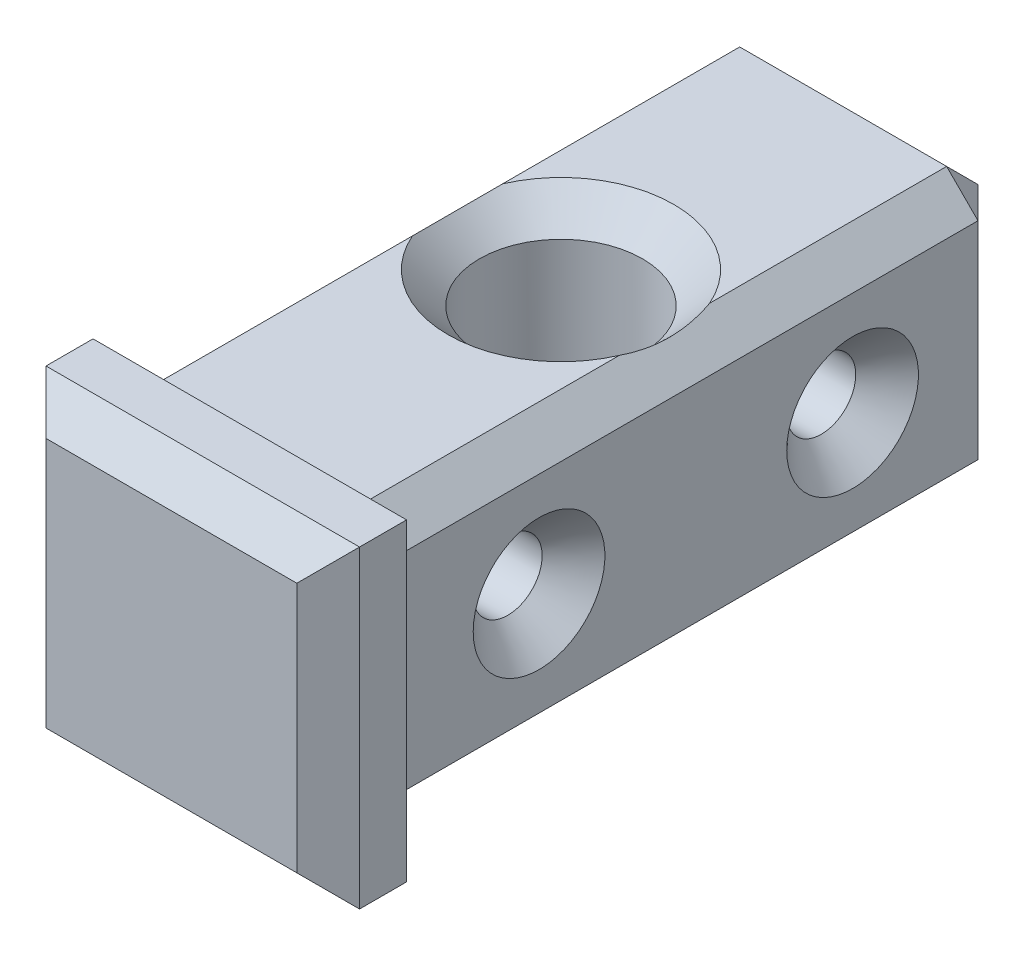
ISO-10303-21;
HEADER;
FILE_DESCRIPTION(('STEP AP214'),'2;1');
FILE_NAME('part.step','',(''),(''),'','','');
FILE_SCHEMA(('AUTOMOTIVE_DESIGN { 1 0 10303 214 1 1 1 1 }'));
ENDSEC;
DATA;
#1=APPLICATION_CONTEXT('core data for automotive mechanical design processes');
#2=APPLICATION_PROTOCOL_DEFINITION('international standard','automotive_design',2000,#1);
#3=PRODUCT_CONTEXT('',#1,'mechanical');
#4=PRODUCT('Part','Part','',(#3));
#5=PRODUCT_RELATED_PRODUCT_CATEGORY('part','',(#4));
#6=PRODUCT_DEFINITION_FORMATION('','',#4);
#7=PRODUCT_DEFINITION_CONTEXT('part definition',#1,'design');
#8=PRODUCT_DEFINITION('design','',#6,#7);
#9=PRODUCT_DEFINITION_SHAPE('','',#8);
#10=(LENGTH_UNIT() NAMED_UNIT(*) SI_UNIT(.MILLI.,.METRE.));
#11=(NAMED_UNIT(*) PLANE_ANGLE_UNIT() SI_UNIT($,.RADIAN.));
#12=(NAMED_UNIT(*) SI_UNIT($,.STERADIAN.) SOLID_ANGLE_UNIT());
#13=UNCERTAINTY_MEASURE_WITH_UNIT(LENGTH_MEASURE(1.E-05),#10,'distance_accuracy_value','');
#14=(GEOMETRIC_REPRESENTATION_CONTEXT(3) GLOBAL_UNCERTAINTY_ASSIGNED_CONTEXT((#13)) GLOBAL_UNIT_ASSIGNED_CONTEXT((#10,
#11,#12)) REPRESENTATION_CONTEXT('',''));
#15=CARTESIAN_POINT('',(0.,0.,0.));
#16=DIRECTION('',(0.,0.,1.));
#17=DIRECTION('',(1.,0.,0.));
#18=AXIS2_PLACEMENT_3D('',#15,#16,#17);
#19=CARTESIAN_POINT('',(0.,21.844,50.8));
#20=DIRECTION('',(0.,-1.,0.));
#21=DIRECTION('',(0.,0.,-1.));
#22=AXIS2_PLACEMENT_3D('',#19,#20,#21);
#23=PLANE('',#22);
#24=CARTESIAN_POINT('',(10.922,21.844,25.4));
#25=DIRECTION('',(0.,-1.,0.));
#26=DIRECTION('',(0.,0.,-1.));
#27=AXIS2_PLACEMENT_3D('',#24,#25,#26);
#28=CIRCLE('',#27,9.14400000000004);
#29=CARTESIAN_POINT('',(2.54000000000003,21.844,21.7455763792356));
#30=VERTEX_POINT('',#29);
#31=CARTESIAN_POINT('',(19.304,21.844,21.7455763792355));
#32=VERTEX_POINT('',#31);
#33=EDGE_CURVE('E373',#30,#32,#28,.T.);
#34=ORIENTED_EDGE('',*,*,#33,.T.);
#35=DIRECTION('',(0.,0.,-1.));
#36=VECTOR('',#35,1.);
#37=CARTESIAN_POINT('',(19.304,21.844,50.8));
#38=LINE('',#37,#36);
#39=CARTESIAN_POINT('',(19.304,21.844,2.54000000000003));
#40=VERTEX_POINT('',#39);
#41=EDGE_CURVE('E382',#32,#40,#38,.T.);
#42=ORIENTED_EDGE('',*,*,#41,.T.);
#43=DIRECTION('',(-1.,0.,0.));
#44=VECTOR('',#43,1.);
#45=CARTESIAN_POINT('',(0.,21.844,2.54000000000003));
#46=LINE('',#45,#44);
#47=CARTESIAN_POINT('',(2.54000000000003,21.844,2.54000000000003));
#48=VERTEX_POINT('',#47);
#49=EDGE_CURVE('E379',#40,#48,#46,.T.);
#50=ORIENTED_EDGE('',*,*,#49,.T.);
#51=DIRECTION('',(0.,0.,1.));
#52=VECTOR('',#51,1.);
#53=CARTESIAN_POINT('',(2.54000000000003,21.844,50.8));
#54=LINE('',#53,#52);
#55=EDGE_CURVE('E376',#48,#30,#54,.T.);
#56=ORIENTED_EDGE('',*,*,#55,.T.);
#57=EDGE_LOOP('',(#34,#42,#50,#56));
#58=FACE_BOUND('',#57,.T.);
#59=ADVANCED_FACE('F41',(#58),#23,.F.);
#60=CARTESIAN_POINT('',(0.,0.,50.8));
#61=DIRECTION('',(0.,1.,0.));
#62=DIRECTION('',(0.,0.,1.));
#63=AXIS2_PLACEMENT_3D('',#60,#61,#62);
#64=PLANE('',#63);
#65=DIRECTION('',(1.,0.,0.));
#66=VECTOR('',#65,1.);
#67=CARTESIAN_POINT('',(0.,0.,50.8));
#68=LINE('',#67,#66);
#69=CARTESIAN_POINT('',(2.54000000000003,0.,50.8));
#70=VERTEX_POINT('',#69);
#71=CARTESIAN_POINT('',(19.304,0.,50.8));
#72=VERTEX_POINT('',#71);
#73=EDGE_CURVE('E241',#70,#72,#68,.T.);
#74=ORIENTED_EDGE('',*,*,#73,.F.);
#75=DIRECTION('',(0.,0.,-1.));
#76=VECTOR('',#75,1.);
#77=CARTESIAN_POINT('',(2.54000000000003,0.,50.8));
#78=LINE('',#77,#76);
#79=CARTESIAN_POINT('',(2.54000000000003,0.,29.0544236207643));
#80=VERTEX_POINT('',#79);
#81=EDGE_CURVE('E276',#70,#80,#78,.T.);
#82=ORIENTED_EDGE('',*,*,#81,.T.);
#83=CARTESIAN_POINT('',(10.922,0.,25.4));
#84=DIRECTION('',(0.,1.,0.));
#85=DIRECTION('',(0.,0.,1.));
#86=AXIS2_PLACEMENT_3D('',#83,#84,#85);
#87=CIRCLE('',#86,9.144);
#88=CARTESIAN_POINT('',(10.922,0.,34.544));
#89=VERTEX_POINT('',#88);
#90=EDGE_CURVE('E272',#80,#89,#87,.T.);
#91=ORIENTED_EDGE('',*,*,#90,.T.);
#92=CARTESIAN_POINT('',(10.922,0.,25.4));
#93=DIRECTION('',(0.,1.,0.));
#94=DIRECTION('',(0.,0.,1.));
#95=AXIS2_PLACEMENT_3D('',#92,#93,#94);
#96=CIRCLE('',#95,9.144);
#97=CARTESIAN_POINT('',(19.304,0.,29.0544236207644));
#98=VERTEX_POINT('',#97);
#99=EDGE_CURVE('E269',#89,#98,#96,.T.);
#100=ORIENTED_EDGE('',*,*,#99,.T.);
#101=DIRECTION('',(0.,0.,1.));
#102=VECTOR('',#101,1.);
#103=CARTESIAN_POINT('',(19.304,0.,50.8));
#104=LINE('',#103,#102);
#105=EDGE_CURVE('E266',#98,#72,#104,.T.);
#106=ORIENTED_EDGE('',*,*,#105,.T.);
#107=EDGE_LOOP('',(#74,#82,#91,#100,#106));
#108=FACE_BOUND('',#107,.T.);
#109=ADVANCED_FACE('F596',(#108),#64,.F.);
#110=CARTESIAN_POINT('',(0.,0.,50.8));
#111=DIRECTION('',(1.,0.,0.));
#112=DIRECTION('',(0.,0.,-1.));
#113=AXIS2_PLACEMENT_3D('',#110,#111,#112);
#114=PLANE('',#113);
#115=CARTESIAN_POINT('',(0.,10.922,38.1));
#116=DIRECTION('',(1.,0.,0.));
#117=DIRECTION('',(0.,0.,-1.));
#118=AXIS2_PLACEMENT_3D('',#115,#116,#117);
#119=CIRCLE('',#118,5.33400000000002);
#120=CARTESIAN_POINT('',(0.,10.922,32.766));
#121=VERTEX_POINT('',#120);
#122=EDGE_CURVE('E348',#121,#121,#119,.T.);
#123=ORIENTED_EDGE('',*,*,#122,.T.);
#124=EDGE_LOOP('',(#123));
#125=FACE_BOUND('',#124,.T.);
#126=CARTESIAN_POINT('',(0.,10.922,12.7));
#127=DIRECTION('',(1.,0.,0.));
#128=DIRECTION('',(0.,0.,-1.));
#129=AXIS2_PLACEMENT_3D('',#126,#127,#128);
#130=CIRCLE('',#129,5.33400000000001);
#131=CARTESIAN_POINT('',(0.,10.922,7.36599999999998));
#132=VERTEX_POINT('',#131);
#133=EDGE_CURVE('E344',#132,#132,#130,.T.);
#134=ORIENTED_EDGE('',*,*,#133,.T.);
#135=EDGE_LOOP('',(#134));
#136=FACE_BOUND('',#135,.T.);
#137=DIRECTION('',(0.,-1.,0.));
#138=VECTOR('',#137,1.);
#139=CARTESIAN_POINT('',(0.,0.,2.54000000000001));
#140=LINE('',#139,#138);
#141=CARTESIAN_POINT('',(0.,19.304,2.54000000000001));
#142=VERTEX_POINT('',#141);
#143=CARTESIAN_POINT('',(0.,2.54000000000001,2.54000000000001));
#144=VERTEX_POINT('',#143);
#145=EDGE_CURVE('E355',#142,#144,#140,.T.);
#146=ORIENTED_EDGE('',*,*,#145,.T.);
#147=DIRECTION('',(0.,0.,1.));
#148=VECTOR('',#147,1.);
#149=CARTESIAN_POINT('',(0.,2.54000000000001,50.8));
#150=LINE('',#149,#148);
#151=CARTESIAN_POINT('',(0.,2.54000000000001,50.8));
#152=VERTEX_POINT('',#151);
#153=EDGE_CURVE('E358',#144,#152,#150,.T.);
#154=ORIENTED_EDGE('',*,*,#153,.T.);
#155=DIRECTION('',(0.,-1.,0.));
#156=VECTOR('',#155,1.);
#157=CARTESIAN_POINT('',(0.,0.,50.8));
#158=LINE('',#157,#156);
#159=CARTESIAN_POINT('',(0.,19.304,50.8));
#160=VERTEX_POINT('',#159);
#161=EDGE_CURVE('E202',#160,#152,#158,.T.);
#162=ORIENTED_EDGE('',*,*,#161,.F.);
#163=DIRECTION('',(0.,0.,-1.));
#164=VECTOR('',#163,1.);
#165=CARTESIAN_POINT('',(0.,19.304,50.8));
#166=LINE('',#165,#164);
#167=EDGE_CURVE('E352',#160,#142,#166,.T.);
#168=ORIENTED_EDGE('',*,*,#167,.T.);
#169=EDGE_LOOP('',(#146,#154,#162,#168));
#170=FACE_BOUND('',#169,.T.);
#171=ADVANCED_FACE('F603',(#125,#136,#170),#114,.F.);
#172=DIRECTION('',(0.,0.,1.));
#173=VECTOR('',#172,1.);
#174=CARTESIAN_POINT('',(19.304,0.,50.8));
#175=LINE('',#174,#173);
#176=CARTESIAN_POINT('',(19.304,0.,2.54000000000001));
#177=VERTEX_POINT('',#176);
#178=CARTESIAN_POINT('',(19.304,0.,21.7455763792356));
#179=VERTEX_POINT('',#178);
#180=EDGE_CURVE('E256',#177,#179,#175,.T.);
#181=ORIENTED_EDGE('',*,*,#180,.T.);
#182=CARTESIAN_POINT('',(10.922,0.,25.4));
#183=DIRECTION('',(0.,1.,0.));
#184=DIRECTION('',(0.,0.,1.));
#185=AXIS2_PLACEMENT_3D('',#182,#183,#184);
#186=CIRCLE('',#185,9.144);
#187=CARTESIAN_POINT('',(2.54000000000003,0.,21.7455763792357));
#188=VERTEX_POINT('',#187);
#189=EDGE_CURVE('E262',#179,#188,#186,.T.);
#190=ORIENTED_EDGE('',*,*,#189,.T.);
#191=DIRECTION('',(0.,0.,-1.));
#192=VECTOR('',#191,1.);
#193=CARTESIAN_POINT('',(2.54000000000003,0.,50.8));
#194=LINE('',#193,#192);
#195=CARTESIAN_POINT('',(2.54000000000003,0.,2.54000000000001));
#196=VERTEX_POINT('',#195);
#197=EDGE_CURVE('E259',#188,#196,#194,.T.);
#198=ORIENTED_EDGE('',*,*,#197,.T.);
#199=DIRECTION('',(1.,0.,0.));
#200=VECTOR('',#199,1.);
#201=CARTESIAN_POINT('',(21.844,0.,2.54000000000001));
#202=LINE('',#201,#200);
#203=EDGE_CURVE('E253',#196,#177,#202,.T.);
#204=ORIENTED_EDGE('',*,*,#203,.T.);
#205=EDGE_LOOP('',(#181,#190,#198,#204));
#206=FACE_BOUND('',#205,.T.);
#207=ADVANCED_FACE('F606',(#206),#64,.F.);
#208=CARTESIAN_POINT('',(21.844,0.,50.8));
#209=DIRECTION('',(-1.,0.,0.));
#210=DIRECTION('',(0.,0.,1.));
#211=AXIS2_PLACEMENT_3D('',#208,#209,#210);
#212=PLANE('',#211);
#213=CARTESIAN_POINT('',(21.844,10.922,12.7));
#214=DIRECTION('',(-1.,0.,0.));
#215=DIRECTION('',(0.,0.,1.));
#216=AXIS2_PLACEMENT_3D('',#213,#214,#215);
#217=CIRCLE('',#216,5.334);
#218=CARTESIAN_POINT('',(21.844,10.922,18.034));
#219=VERTEX_POINT('',#218);
#220=EDGE_CURVE('E300',#219,#219,#217,.T.);
#221=ORIENTED_EDGE('',*,*,#220,.T.);
#222=EDGE_LOOP('',(#221));
#223=FACE_BOUND('',#222,.T.);
#224=CARTESIAN_POINT('',(21.844,10.922,38.1));
#225=DIRECTION('',(-1.,0.,0.));
#226=DIRECTION('',(0.,0.,1.));
#227=AXIS2_PLACEMENT_3D('',#224,#225,#226);
#228=CIRCLE('',#227,5.33399999999999);
#229=CARTESIAN_POINT('',(21.844,10.922,43.434));
#230=VERTEX_POINT('',#229);
#231=EDGE_CURVE('E296',#230,#230,#228,.T.);
#232=ORIENTED_EDGE('',*,*,#231,.T.);
#233=EDGE_LOOP('',(#232));
#234=FACE_BOUND('',#233,.T.);
#235=DIRECTION('',(0.,1.,0.));
#236=VECTOR('',#235,1.);
#237=CARTESIAN_POINT('',(21.844,0.,50.8));
#238=LINE('',#237,#236);
#239=CARTESIAN_POINT('',(21.844,2.54000000000001,50.8));
#240=VERTEX_POINT('',#239);
#241=CARTESIAN_POINT('',(21.844,19.304,50.8));
#242=VERTEX_POINT('',#241);
#243=EDGE_CURVE('E245',#240,#242,#238,.T.);
#244=ORIENTED_EDGE('',*,*,#243,.F.);
#245=DIRECTION('',(0.,0.,-1.));
#246=VECTOR('',#245,1.);
#247=CARTESIAN_POINT('',(21.844,2.54000000000001,50.8));
#248=LINE('',#247,#246);
#249=CARTESIAN_POINT('',(21.844,2.54000000000001,2.54000000000001));
#250=VERTEX_POINT('',#249);
#251=EDGE_CURVE('E293',#240,#250,#248,.T.);
#252=ORIENTED_EDGE('',*,*,#251,.T.);
#253=DIRECTION('',(0.,1.,0.));
#254=VECTOR('',#253,1.);
#255=CARTESIAN_POINT('',(21.844,21.844,2.54000000000001));
#256=LINE('',#255,#254);
#257=CARTESIAN_POINT('',(21.844,19.304,2.54000000000001));
#258=VERTEX_POINT('',#257);
#259=EDGE_CURVE('E287',#250,#258,#256,.T.);
#260=ORIENTED_EDGE('',*,*,#259,.T.);
#261=DIRECTION('',(0.,0.,1.));
#262=VECTOR('',#261,1.);
#263=CARTESIAN_POINT('',(21.844,19.304,50.8));
#264=LINE('',#263,#262);
#265=EDGE_CURVE('E290',#258,#242,#264,.T.);
#266=ORIENTED_EDGE('',*,*,#265,.T.);
#267=EDGE_LOOP('',(#244,#252,#260,#266));
#268=FACE_BOUND('',#267,.T.);
#269=ADVANCED_FACE('F611',(#223,#234,#268),#212,.F.);
#270=DIRECTION('',(-1.,0.,0.));
#271=VECTOR('',#270,1.);
#272=CARTESIAN_POINT('',(0.,21.844,50.8));
#273=LINE('',#272,#271);
#274=CARTESIAN_POINT('',(19.304,21.844,50.8));
#275=VERTEX_POINT('',#274);
#276=CARTESIAN_POINT('',(2.54000000000003,21.844,50.8));
#277=VERTEX_POINT('',#276);
#278=EDGE_CURVE('E249',#275,#277,#273,.T.);
#279=ORIENTED_EDGE('',*,*,#278,.F.);
#280=DIRECTION('',(0.,0.,-1.));
#281=VECTOR('',#280,1.);
#282=CARTESIAN_POINT('',(19.304,21.844,50.8));
#283=LINE('',#282,#281);
#284=CARTESIAN_POINT('',(19.304,21.844,29.0544236207645));
#285=VERTEX_POINT('',#284);
#286=EDGE_CURVE('E370',#275,#285,#283,.T.);
#287=ORIENTED_EDGE('',*,*,#286,.T.);
#288=CARTESIAN_POINT('',(10.922,21.844,25.4));
#289=DIRECTION('',(0.,-1.,0.));
#290=DIRECTION('',(0.,0.,-1.));
#291=AXIS2_PLACEMENT_3D('',#288,#289,#290);
#292=CIRCLE('',#291,9.14400000000004);
#293=CARTESIAN_POINT('',(10.922,21.844,34.544));
#294=VERTEX_POINT('',#293);
#295=EDGE_CURVE('E364',#285,#294,#292,.T.);
#296=ORIENTED_EDGE('',*,*,#295,.T.);
#297=CARTESIAN_POINT('',(10.922,21.844,25.4));
#298=DIRECTION('',(0.,-1.,0.));
#299=DIRECTION('',(0.,0.,-1.));
#300=AXIS2_PLACEMENT_3D('',#297,#298,#299);
#301=CIRCLE('',#300,9.14400000000004);
#302=CARTESIAN_POINT('',(2.54000000000003,21.844,29.0544236207644));
#303=VERTEX_POINT('',#302);
#304=EDGE_CURVE('E361',#294,#303,#301,.T.);
#305=ORIENTED_EDGE('',*,*,#304,.T.);
#306=DIRECTION('',(0.,0.,1.));
#307=VECTOR('',#306,1.);
#308=CARTESIAN_POINT('',(2.54000000000003,21.844,50.8));
#309=LINE('',#308,#307);
#310=EDGE_CURVE('E367',#303,#277,#309,.T.);
#311=ORIENTED_EDGE('',*,*,#310,.T.);
#312=EDGE_LOOP('',(#279,#287,#296,#305,#311));
#313=FACE_BOUND('',#312,.T.);
#314=ADVANCED_FACE('F599',(#313),#23,.F.);
#315=CARTESIAN_POINT('',(0.,0.,0.));
#316=DIRECTION('',(0.,0.,-1.));
#317=DIRECTION('',(-1.,0.,0.));
#318=AXIS2_PLACEMENT_3D('',#315,#316,#317);
#319=PLANE('',#318);
#320=DIRECTION('',(1.,0.,0.));
#321=VECTOR('',#320,1.);
#322=CARTESIAN_POINT('',(21.844,19.304,0.));
#323=LINE('',#322,#321);
#324=CARTESIAN_POINT('',(2.54000000000003,19.304,0.));
#325=VERTEX_POINT('',#324);
#326=CARTESIAN_POINT('',(19.304,19.304,0.));
#327=VERTEX_POINT('',#326);
#328=EDGE_CURVE('E386',#325,#327,#323,.T.);
#329=ORIENTED_EDGE('',*,*,#328,.T.);
#330=DIRECTION('',(0.,-1.,0.));
#331=VECTOR('',#330,1.);
#332=CARTESIAN_POINT('',(19.304,0.,0.));
#333=LINE('',#332,#331);
#334=CARTESIAN_POINT('',(19.304,2.54000000000003,0.));
#335=VERTEX_POINT('',#334);
#336=EDGE_CURVE('E394',#327,#335,#333,.T.);
#337=ORIENTED_EDGE('',*,*,#336,.T.);
#338=DIRECTION('',(-1.,0.,0.));
#339=VECTOR('',#338,1.);
#340=CARTESIAN_POINT('',(0.,2.54000000000003,0.));
#341=LINE('',#340,#339);
#342=CARTESIAN_POINT('',(2.54000000000003,2.54000000000003,0.));
#343=VERTEX_POINT('',#342);
#344=EDGE_CURVE('E68',#335,#343,#341,.T.);
#345=ORIENTED_EDGE('',*,*,#344,.T.);
#346=DIRECTION('',(0.,1.,0.));
#347=VECTOR('',#346,1.);
#348=CARTESIAN_POINT('',(2.54000000000003,21.844,0.));
#349=LINE('',#348,#347);
#350=EDGE_CURVE('E389',#343,#325,#349,.T.);
#351=ORIENTED_EDGE('',*,*,#350,.T.);
#352=EDGE_LOOP('',(#329,#337,#345,#351));
#353=FACE_BOUND('',#352,.T.);
#354=ADVANCED_FACE('F610',(#353),#319,.T.);
#355=CARTESIAN_POINT('',(-1.5875,-1.9685,57.15));
#356=DIRECTION('',(1.,0.,0.));
#357=DIRECTION('',(0.,0.,-1.));
#358=AXIS2_PLACEMENT_3D('',#355,#356,#357);
#359=PLANE('',#358);
#360=DIRECTION('',(0.,0.,-1.));
#361=VECTOR('',#360,1.);
#362=CARTESIAN_POINT('',(-1.5875,-1.9685,57.15));
#363=LINE('',#362,#361);
#364=CARTESIAN_POINT('',(-1.5875,-1.9685,54.61));
#365=VERTEX_POINT('',#364);
#366=CARTESIAN_POINT('',(-1.5875,-1.9685,50.8));
#367=VERTEX_POINT('',#366);
#368=EDGE_CURVE('E191',#365,#367,#363,.T.);
#369=ORIENTED_EDGE('',*,*,#368,.F.);
#370=DIRECTION('',(0.,1.,0.));
#371=VECTOR('',#370,1.);
#372=CARTESIAN_POINT('',(-1.5875,-1.9685,54.61));
#373=LINE('',#372,#371);
#374=CARTESIAN_POINT('',(-1.5875,23.4315,54.61));
#375=VERTEX_POINT('',#374);
#376=EDGE_CURVE('E338',#365,#375,#373,.T.);
#377=ORIENTED_EDGE('',*,*,#376,.T.);
#378=DIRECTION('',(0.,0.,-1.));
#379=VECTOR('',#378,1.);
#380=CARTESIAN_POINT('',(-1.5875,23.4315,57.15));
#381=LINE('',#380,#379);
#382=CARTESIAN_POINT('',(-1.5875,23.4315,50.8));
#383=VERTEX_POINT('',#382);
#384=EDGE_CURVE('E216',#375,#383,#381,.T.);
#385=ORIENTED_EDGE('',*,*,#384,.T.);
#386=DIRECTION('',(0.,-1.,0.));
#387=VECTOR('',#386,1.);
#388=CARTESIAN_POINT('',(-1.5875,-1.9685,50.8));
#389=LINE('',#388,#387);
#390=EDGE_CURVE('E209',#383,#367,#389,.T.);
#391=ORIENTED_EDGE('',*,*,#390,.T.);
#392=EDGE_LOOP('',(#369,#377,#385,#391));
#393=FACE_BOUND('',#392,.T.);
#394=ADVANCED_FACE('F214',(#393),#359,.F.);
#395=CARTESIAN_POINT('',(-1.5875,-1.9685,57.15));
#396=DIRECTION('',(0.,1.,0.));
#397=DIRECTION('',(0.,0.,1.));
#398=AXIS2_PLACEMENT_3D('',#395,#396,#397);
#399=PLANE('',#398);
#400=DIRECTION('',(0.,0.,-1.));
#401=VECTOR('',#400,1.);
#402=CARTESIAN_POINT('',(23.8125,-1.9685,57.15));
#403=LINE('',#402,#401);
#404=CARTESIAN_POINT('',(23.8125,-1.9685,54.61));
#405=VERTEX_POINT('',#404);
#406=CARTESIAN_POINT('',(23.8125,-1.9685,50.8));
#407=VERTEX_POINT('',#406);
#408=EDGE_CURVE('E203',#405,#407,#403,.T.);
#409=ORIENTED_EDGE('',*,*,#408,.F.);
#410=DIRECTION('',(-1.,0.,0.));
#411=VECTOR('',#410,1.);
#412=CARTESIAN_POINT('',(-1.5875,-1.9685,54.61));
#413=LINE('',#412,#411);
#414=EDGE_CURVE('E198',#405,#365,#413,.T.);
#415=ORIENTED_EDGE('',*,*,#414,.T.);
#416=ORIENTED_EDGE('',*,*,#368,.T.);
#417=DIRECTION('',(1.,0.,0.));
#418=VECTOR('',#417,1.);
#419=CARTESIAN_POINT('',(-1.5875,-1.9685,50.8));
#420=LINE('',#419,#418);
#421=EDGE_CURVE('E195',#367,#407,#420,.T.);
#422=ORIENTED_EDGE('',*,*,#421,.T.);
#423=EDGE_LOOP('',(#409,#415,#416,#422));
#424=FACE_BOUND('',#423,.T.);
#425=ADVANCED_FACE('F194',(#424),#399,.F.);
#426=CARTESIAN_POINT('',(23.8125,-1.9685,57.15));
#427=DIRECTION('',(-1.,0.,0.));
#428=DIRECTION('',(0.,0.,1.));
#429=AXIS2_PLACEMENT_3D('',#426,#427,#428);
#430=PLANE('',#429);
#431=DIRECTION('',(0.,0.,-1.));
#432=VECTOR('',#431,1.);
#433=CARTESIAN_POINT('',(23.8125,23.4315,57.15));
#434=LINE('',#433,#432);
#435=CARTESIAN_POINT('',(23.8125,23.4315,54.61));
#436=VERTEX_POINT('',#435);
#437=CARTESIAN_POINT('',(23.8125,23.4315,50.8));
#438=VERTEX_POINT('',#437);
#439=EDGE_CURVE('E233',#436,#438,#434,.T.);
#440=ORIENTED_EDGE('',*,*,#439,.F.);
#441=DIRECTION('',(0.,-1.,0.));
#442=VECTOR('',#441,1.);
#443=CARTESIAN_POINT('',(23.8125,-1.9685,54.61));
#444=LINE('',#443,#442);
#445=EDGE_CURVE('E335',#436,#405,#444,.T.);
#446=ORIENTED_EDGE('',*,*,#445,.T.);
#447=ORIENTED_EDGE('',*,*,#408,.T.);
#448=DIRECTION('',(0.,1.,0.));
#449=VECTOR('',#448,1.);
#450=CARTESIAN_POINT('',(23.8125,-1.9685,50.8));
#451=LINE('',#450,#449);
#452=EDGE_CURVE('E211',#407,#438,#451,.T.);
#453=ORIENTED_EDGE('',*,*,#452,.T.);
#454=EDGE_LOOP('',(#440,#446,#447,#453));
#455=FACE_BOUND('',#454,.T.);
#456=ADVANCED_FACE('F746',(#455),#430,.F.);
#457=CARTESIAN_POINT('',(-1.5875,23.4315,57.15));
#458=DIRECTION('',(0.,-1.,0.));
#459=DIRECTION('',(0.,0.,-1.));
#460=AXIS2_PLACEMENT_3D('',#457,#458,#459);
#461=PLANE('',#460);
#462=ORIENTED_EDGE('',*,*,#384,.F.);
#463=DIRECTION('',(1.,0.,0.));
#464=VECTOR('',#463,1.);
#465=CARTESIAN_POINT('',(-1.5875,23.4315,54.61));
#466=LINE('',#465,#464);
#467=EDGE_CURVE('E341',#375,#436,#466,.T.);
#468=ORIENTED_EDGE('',*,*,#467,.T.);
#469=ORIENTED_EDGE('',*,*,#439,.T.);
#470=DIRECTION('',(-1.,0.,0.));
#471=VECTOR('',#470,1.);
#472=CARTESIAN_POINT('',(-1.5875,23.4315,50.8));
#473=LINE('',#472,#471);
#474=EDGE_CURVE('E228',#438,#383,#473,.T.);
#475=ORIENTED_EDGE('',*,*,#474,.T.);
#476=EDGE_LOOP('',(#462,#468,#469,#475));
#477=FACE_BOUND('',#476,.T.);
#478=ADVANCED_FACE('F741',(#477),#461,.F.);
#479=CARTESIAN_POINT('',(0.,0.,57.15));
#480=DIRECTION('',(0.,0.,-1.));
#481=DIRECTION('',(-1.,0.,0.));
#482=AXIS2_PLACEMENT_3D('',#479,#480,#481);
#483=PLANE('',#482);
#484=DIRECTION('',(0.,-1.,0.));
#485=VECTOR('',#484,1.);
#486=CARTESIAN_POINT('',(0.952500000000001,0.,57.15));
#487=LINE('',#486,#485);
#488=CARTESIAN_POINT('',(0.952500000000001,20.8915,57.15));
#489=VERTEX_POINT('',#488);
#490=CARTESIAN_POINT('',(0.952500000000001,0.571499999999999,57.15));
#491=VERTEX_POINT('',#490);
#492=EDGE_CURVE('E323',#489,#491,#487,.T.);
#493=ORIENTED_EDGE('',*,*,#492,.T.);
#494=DIRECTION('',(1.,0.,0.));
#495=VECTOR('',#494,1.);
#496=CARTESIAN_POINT('',(0.,0.571499999999999,57.15));
#497=LINE('',#496,#495);
#498=CARTESIAN_POINT('',(21.2725,0.571499999999999,57.15));
#499=VERTEX_POINT('',#498);
#500=EDGE_CURVE('E329',#491,#499,#497,.T.);
#501=ORIENTED_EDGE('',*,*,#500,.T.);
#502=DIRECTION('',(0.,1.,0.));
#503=VECTOR('',#502,1.);
#504=CARTESIAN_POINT('',(21.2725,0.,57.15));
#505=LINE('',#504,#503);
#506=CARTESIAN_POINT('',(21.2725,20.8915,57.15));
#507=VERTEX_POINT('',#506);
#508=EDGE_CURVE('E326',#499,#507,#505,.T.);
#509=ORIENTED_EDGE('',*,*,#508,.T.);
#510=DIRECTION('',(-1.,0.,0.));
#511=VECTOR('',#510,1.);
#512=CARTESIAN_POINT('',(0.,20.8915,57.15));
#513=LINE('',#512,#511);
#514=EDGE_CURVE('E320',#507,#489,#513,.T.);
#515=ORIENTED_EDGE('',*,*,#514,.T.);
#516=EDGE_LOOP('',(#493,#501,#509,#515));
#517=FACE_BOUND('',#516,.T.);
#518=ADVANCED_FACE('F736',(#517),#483,.F.);
#519=CARTESIAN_POINT('',(0.,0.,50.8));
#520=DIRECTION('',(0.,0.,-1.));
#521=DIRECTION('',(-1.,0.,0.));
#522=AXIS2_PLACEMENT_3D('',#519,#520,#521);
#523=PLANE('',#522);
#524=ORIENTED_EDGE('',*,*,#243,.T.);
#525=DIRECTION('',(0.70710678118655,-0.707106781186545,0.));
#526=VECTOR('',#525,1.);
#527=CARTESIAN_POINT('',(19.304,21.844,50.8));
#528=LINE('',#527,#526);
#529=EDGE_CURVE('E52',#242,#275,#528,.F.);
#530=ORIENTED_EDGE('',*,*,#529,.T.);
#531=ORIENTED_EDGE('',*,*,#278,.T.);
#532=DIRECTION('',(0.70710678118655,0.707106781186545,0.));
#533=VECTOR('',#532,1.);
#534=CARTESIAN_POINT('',(0.,19.304,50.8));
#535=LINE('',#534,#533);
#536=EDGE_CURVE('E11',#277,#160,#535,.F.);
#537=ORIENTED_EDGE('',*,*,#536,.T.);
#538=ORIENTED_EDGE('',*,*,#161,.T.);
#539=DIRECTION('',(-0.70710678118655,0.707106781186545,0.));
#540=VECTOR('',#539,1.);
#541=CARTESIAN_POINT('',(2.54000000000003,0.,50.8));
#542=LINE('',#541,#540);
#543=EDGE_CURVE('E397',#152,#70,#542,.F.);
#544=ORIENTED_EDGE('',*,*,#543,.T.);
#545=ORIENTED_EDGE('',*,*,#73,.T.);
#546=DIRECTION('',(-0.70710678118655,-0.707106781186545,0.));
#547=VECTOR('',#546,1.);
#548=CARTESIAN_POINT('',(21.844,2.54000000000001,50.8));
#549=LINE('',#548,#547);
#550=EDGE_CURVE('E400',#72,#240,#549,.F.);
#551=ORIENTED_EDGE('',*,*,#550,.T.);
#552=EDGE_LOOP('',(#524,#530,#531,#537,#538,#544,#545,#551));
#553=FACE_BOUND('',#552,.T.);
#554=ORIENTED_EDGE('',*,*,#390,.F.);
#555=ORIENTED_EDGE('',*,*,#474,.F.);
#556=ORIENTED_EDGE('',*,*,#452,.F.);
#557=ORIENTED_EDGE('',*,*,#421,.F.);
#558=EDGE_LOOP('',(#554,#555,#556,#557));
#559=FACE_BOUND('',#558,.T.);
#560=ADVANCED_FACE('F207',(#553,#559),#523,.T.);
#561=CARTESIAN_POINT('',(23.8125,10.922,12.7));
#562=DIRECTION('',(-1.,0.,0.));
#563=DIRECTION('',(0.,0.,1.));
#564=AXIS2_PLACEMENT_3D('',#561,#562,#563);
#565=CYLINDRICAL_SURFACE('',#564,2.794);
#566=CARTESIAN_POINT('',(19.304,10.922,12.7));
#567=DIRECTION('',(-1.,0.,0.));
#568=DIRECTION('',(0.,0.,1.));
#569=AXIS2_PLACEMENT_3D('',#566,#567,#568);
#570=CIRCLE('',#569,2.794);
#571=CARTESIAN_POINT('',(19.304,10.922,15.494));
#572=VERTEX_POINT('',#571);
#573=EDGE_CURVE('E308',#572,#572,#570,.F.);
#574=ORIENTED_EDGE('',*,*,#573,.T.);
#575=EDGE_LOOP('',(#574));
#576=FACE_BOUND('',#575,.T.);
#577=CARTESIAN_POINT('',(2.54,10.922,12.7));
#578=DIRECTION('',(1.,0.,0.));
#579=DIRECTION('',(0.,0.,-1.));
#580=AXIS2_PLACEMENT_3D('',#577,#578,#579);
#581=CIRCLE('',#580,2.794);
#582=CARTESIAN_POINT('',(2.54,10.922,9.906));
#583=VERTEX_POINT('',#582);
#584=EDGE_CURVE('E304',#583,#583,#581,.F.);
#585=ORIENTED_EDGE('',*,*,#584,.T.);
#586=EDGE_LOOP('',(#585));
#587=FACE_BOUND('',#586,.T.);
#588=ADVANCED_FACE('F724',(#576,#587),#565,.F.);
#589=CARTESIAN_POINT('',(23.8125,10.922,38.1));
#590=DIRECTION('',(-1.,0.,0.));
#591=DIRECTION('',(0.,0.,1.));
#592=AXIS2_PLACEMENT_3D('',#589,#590,#591);
#593=CYLINDRICAL_SURFACE('',#592,2.794);
#594=CARTESIAN_POINT('',(19.304,10.922,38.1));
#595=DIRECTION('',(-1.,0.,0.));
#596=DIRECTION('',(0.,0.,1.));
#597=AXIS2_PLACEMENT_3D('',#594,#595,#596);
#598=CIRCLE('',#597,2.794);
#599=CARTESIAN_POINT('',(19.304,10.922,40.894));
#600=VERTEX_POINT('',#599);
#601=EDGE_CURVE('E316',#600,#600,#598,.F.);
#602=ORIENTED_EDGE('',*,*,#601,.T.);
#603=EDGE_LOOP('',(#602));
#604=FACE_BOUND('',#603,.T.);
#605=CARTESIAN_POINT('',(2.54000000000002,10.922,38.1));
#606=DIRECTION('',(1.,0.,0.));
#607=DIRECTION('',(0.,0.,-1.));
#608=AXIS2_PLACEMENT_3D('',#605,#606,#607);
#609=CIRCLE('',#608,2.794);
#610=CARTESIAN_POINT('',(2.54000000000002,10.922,35.306));
#611=VERTEX_POINT('',#610);
#612=EDGE_CURVE('E312',#611,#611,#609,.F.);
#613=ORIENTED_EDGE('',*,*,#612,.T.);
#614=EDGE_LOOP('',(#613));
#615=FACE_BOUND('',#614,.T.);
#616=ADVANCED_FACE('F726',(#604,#615),#593,.F.);
#617=CARTESIAN_POINT('',(10.922,-1.9685,25.4));
#618=DIRECTION('',(0.,1.,0.));
#619=DIRECTION('',(0.,0.,1.));
#620=AXIS2_PLACEMENT_3D('',#617,#618,#619);
#621=CYLINDRICAL_SURFACE('',#620,6.604);
#622=CARTESIAN_POINT('',(10.922,2.54000000000001,25.4));
#623=DIRECTION('',(0.,1.,0.));
#624=DIRECTION('',(0.,0.,1.));
#625=AXIS2_PLACEMENT_3D('',#622,#623,#624);
#626=CIRCLE('',#625,6.604);
#627=CARTESIAN_POINT('',(10.922,2.54000000000001,32.004));
#628=VERTEX_POINT('',#627);
#629=EDGE_CURVE('E283',#628,#628,#626,.F.);
#630=ORIENTED_EDGE('',*,*,#629,.T.);
#631=EDGE_LOOP('',(#630));
#632=FACE_BOUND('',#631,.T.);
#633=CARTESIAN_POINT('',(10.922,19.304,25.4));
#634=DIRECTION('',(0.,-1.,0.));
#635=DIRECTION('',(0.,0.,-1.));
#636=AXIS2_PLACEMENT_3D('',#633,#634,#635);
#637=CIRCLE('',#636,6.604);
#638=CARTESIAN_POINT('',(10.922,19.304,18.796));
#639=VERTEX_POINT('',#638);
#640=EDGE_CURVE('E279',#639,#639,#637,.F.);
#641=ORIENTED_EDGE('',*,*,#640,.T.);
#642=EDGE_LOOP('',(#641));
#643=FACE_BOUND('',#642,.T.);
#644=ADVANCED_FACE('F733',(#632,#643),#621,.F.);
#645=CARTESIAN_POINT('',(10.922,19.304,25.4));
#646=DIRECTION('',(0.,1.,0.));
#647=DIRECTION('',(0.,0.,1.));
#648=AXIS2_PLACEMENT_3D('',#645,#646,#647);
#649=CONICAL_SURFACE('',#648,6.604,0.785398163397452);
#650=ORIENTED_EDGE('',*,*,#640,.F.);
#651=EDGE_LOOP('',(#650));
#652=FACE_BOUND('',#651,.T.);
#653=ORIENTED_EDGE('',*,*,#304,.F.);
#654=ORIENTED_EDGE('',*,*,#295,.F.);
#655=CARTESIAN_POINT('',(19.3037999999995,21.8442000000005,21.7446173387704));
#656=CARTESIAN_POINT('',(19.3411694493706,21.8068305506293,21.9237635112057));
#657=CARTESIAN_POINT('',(19.376004443306,21.771995556694,22.1039761586424));
#658=CARTESIAN_POINT('',(19.4403973691688,21.7076026308312,22.466300948094));
#659=CARTESIAN_POINT('',(19.4699546041026,21.6780453958974,22.6484133376372));
#660=CARTESIAN_POINT('',(19.5235911967835,21.6244088032164,23.0143748512867));
#661=CARTESIAN_POINT('',(19.5476670051206,21.6003329948794,23.1982250208806));
#662=CARTESIAN_POINT('',(19.5901394019652,21.5578605980348,23.5672118509161));
#663=CARTESIAN_POINT('',(19.6085362777724,21.5394637222276,23.7523484457923));
#664=CARTESIAN_POINT('',(19.6542130646284,21.4937869353716,24.2999910054804));
#665=CARTESIAN_POINT('',(19.6733317195202,21.4746682804797,24.6639324339076));
#666=CARTESIAN_POINT('',(19.68878320089,21.45921679911,25.3925787270202));
#667=CARTESIAN_POINT('',(19.6851282245962,21.4628717754038,25.7572830784759));
#668=CARTESIAN_POINT('',(19.6600382439312,21.4879617560688,26.3673357759901));
#669=CARTESIAN_POINT('',(19.6447215115664,21.5032784884336,26.6132214527381));
#670=CARTESIAN_POINT('',(19.6039422744449,21.5440577255551,27.1033096967655));
#671=CARTESIAN_POINT('',(19.5784799314815,21.5695200685185,27.347512290822));
#672=CARTESIAN_POINT('',(19.5172185016207,21.6307814983793,27.8376506131817));
#673=CARTESIAN_POINT('',(19.4812483281598,21.6667516718401,28.0835433214277));
#674=CARTESIAN_POINT('',(19.3996473095216,21.7483526904784,28.5720669939019));
#675=CARTESIAN_POINT('',(19.3540179380107,21.7939820619893,28.8146984496883));
#676=CARTESIAN_POINT('',(19.3037999999995,21.8442000000005,29.0553826612296));
#677=B_SPLINE_CURVE_WITH_KNOTS('',3,(#655,#656,#657,#658,#659,#660,#661,#662,#663,#664,#665,
#666,#667,#668,#669,#670,#671,#672,#673,#674,#675,#676),.UNSPECIFIED.,.F.,.F.,(4,2,2,2,2,2,2,2,
2,2,4),(0.,0.560311050666026,1.12069604272994,1.68144287757918,2.24216133935929,3.3354969353701,
4.4282470069603,5.1683641925483,5.90846957586637,6.66136950899705,7.41415465777826),.UNSPECIFIED.);
#678=EDGE_CURVE('E219',#32,#285,#677,.T.);
#679=ORIENTED_EDGE('',*,*,#678,.F.);
#680=ORIENTED_EDGE('',*,*,#33,.F.);
#681=CARTESIAN_POINT('',(2.5402000000005,21.8442000000005,29.0553826612295));
#682=CARTESIAN_POINT('',(2.50283055062936,21.8068305506293,28.8762364887943));
#683=CARTESIAN_POINT('',(2.46799555669401,21.771995556694,28.6960238413576));
#684=CARTESIAN_POINT('',(2.40360263083122,21.7076026308312,28.333699051906));
#685=CARTESIAN_POINT('',(2.37404539589745,21.6780453958974,28.1515866623628));
#686=CARTESIAN_POINT('',(2.32040880321647,21.6244088032164,27.7856251487133));
#687=CARTESIAN_POINT('',(2.29633299487943,21.6003329948794,27.6017749791194));
#688=CARTESIAN_POINT('',(2.25386059803479,21.5578605980348,27.2327881490838));
#689=CARTESIAN_POINT('',(2.23546372222761,21.5394637222276,27.0476515542077));
#690=CARTESIAN_POINT('',(2.18978693537164,21.4937869353716,26.5000089945196));
#691=CARTESIAN_POINT('',(2.17066828047977,21.4746682804797,26.1360675660924));
#692=CARTESIAN_POINT('',(2.15521679911002,21.45921679911,25.4074212729798));
#693=CARTESIAN_POINT('',(2.15887177540379,21.4628717754038,25.0427169215241));
#694=CARTESIAN_POINT('',(2.18396175606879,21.4879617560688,24.4326642240098));
#695=CARTESIAN_POINT('',(2.19927848843358,21.5032784884336,24.1867785472619));
#696=CARTESIAN_POINT('',(2.2400577255551,21.5440577255551,23.6966903032345));
#697=CARTESIAN_POINT('',(2.26552006851849,21.5695200685185,23.452487709178));
#698=CARTESIAN_POINT('',(2.32678149837928,21.6307814983793,22.9623493868183));
#699=CARTESIAN_POINT('',(2.36275167184018,21.6667516718402,22.7164566785723));
#700=CARTESIAN_POINT('',(2.44435269047844,21.7483526904784,22.2279330060981));
#701=CARTESIAN_POINT('',(2.48998206198934,21.7939820619893,21.9853015503117));
#702=CARTESIAN_POINT('',(2.5402000000005,21.8442000000005,21.7446173387704));
#703=B_SPLINE_CURVE_WITH_KNOTS('',3,(#681,#682,#683,#684,#685,#686,#687,#688,#689,#690,#691,
#692,#693,#694,#695,#696,#697,#698,#699,#700,#701,#702),.UNSPECIFIED.,.F.,.F.,(4,2,2,2,2,2,2,2,
2,2,4),(0.,0.560311050666029,1.12069604272994,1.68144287757919,2.2421613393593,3.3354969353701,
4.4282470069603,5.1683641925483,5.90846957586637,6.66136950899703,7.41415465777824),.UNSPECIFIED.);
#704=EDGE_CURVE('E223',#303,#30,#703,.T.);
#705=ORIENTED_EDGE('',*,*,#704,.F.);
#706=EDGE_LOOP('',(#653,#654,#679,#680,#705));
#707=FACE_BOUND('',#706,.T.);
#708=ADVANCED_FACE('F507',(#652,#707),#649,.F.);
#709=CARTESIAN_POINT('',(19.304,21.844,50.8));
#710=DIRECTION('',(-0.707106781186545,-0.70710678118655,0.));
#711=DIRECTION('',(0.,0.,-1.));
#712=AXIS2_PLACEMENT_3D('',#709,#710,#711);
#713=PLANE('',#712);
#714=ORIENTED_EDGE('',*,*,#529,.F.);
#715=ORIENTED_EDGE('',*,*,#265,.F.);
#716=DIRECTION('',(-0.70710678118655,0.707106781186545,0.));
#717=VECTOR('',#716,1.);
#718=CARTESIAN_POINT('',(19.304,21.844,2.54000000000003));
#719=LINE('',#718,#717);
#720=EDGE_CURVE('E518',#40,#258,#719,.F.);
#721=ORIENTED_EDGE('',*,*,#720,.F.);
#722=ORIENTED_EDGE('',*,*,#41,.F.);
#723=ORIENTED_EDGE('',*,*,#678,.T.);
#724=ORIENTED_EDGE('',*,*,#286,.F.);
#725=EDGE_LOOP('',(#714,#715,#721,#722,#723,#724));
#726=FACE_BOUND('',#725,.T.);
#727=ADVANCED_FACE('F537',(#726),#713,.F.);
#728=CARTESIAN_POINT('',(0.,21.844,2.54000000000003));
#729=DIRECTION('',(0.,0.70710678118655,-0.707106781186545));
#730=DIRECTION('',(1.,0.,0.));
#731=AXIS2_PLACEMENT_3D('',#728,#729,#730);
#732=PLANE('',#731);
#733=DIRECTION('',(0.,-0.707106781186545,-0.70710678118655));
#734=VECTOR('',#733,1.);
#735=CARTESIAN_POINT('',(2.54000000000003,19.304,0.));
#736=LINE('',#735,#734);
#737=EDGE_CURVE('E691',#48,#325,#736,.T.);
#738=ORIENTED_EDGE('',*,*,#737,.F.);
#739=ORIENTED_EDGE('',*,*,#49,.F.);
#740=DIRECTION('',(0.,0.707106781186545,0.70710678118655));
#741=VECTOR('',#740,1.);
#742=CARTESIAN_POINT('',(19.304,21.844,2.54000000000003));
#743=LINE('',#742,#741);
#744=EDGE_CURVE('E694',#327,#40,#743,.T.);
#745=ORIENTED_EDGE('',*,*,#744,.F.);
#746=ORIENTED_EDGE('',*,*,#328,.F.);
#747=EDGE_LOOP('',(#738,#739,#745,#746));
#748=FACE_BOUND('',#747,.T.);
#749=ADVANCED_FACE('F536',(#748),#732,.T.);
#750=CARTESIAN_POINT('',(0.,19.304,50.8));
#751=DIRECTION('',(0.707106781186545,-0.70710678118655,0.));
#752=DIRECTION('',(0.,0.,-1.));
#753=AXIS2_PLACEMENT_3D('',#750,#751,#752);
#754=PLANE('',#753);
#755=ORIENTED_EDGE('',*,*,#704,.T.);
#756=ORIENTED_EDGE('',*,*,#55,.F.);
#757=DIRECTION('',(-0.70710678118655,-0.707106781186545,0.));
#758=VECTOR('',#757,1.);
#759=CARTESIAN_POINT('',(1.27000000000001,20.574,2.54000000000002));
#760=LINE('',#759,#758);
#761=EDGE_CURVE('E687',#142,#48,#760,.F.);
#762=ORIENTED_EDGE('',*,*,#761,.F.);
#763=ORIENTED_EDGE('',*,*,#167,.F.);
#764=ORIENTED_EDGE('',*,*,#536,.F.);
#765=ORIENTED_EDGE('',*,*,#310,.F.);
#766=EDGE_LOOP('',(#755,#756,#762,#763,#764,#765));
#767=FACE_BOUND('',#766,.T.);
#768=ADVANCED_FACE('F500',(#767),#754,.F.);
#769=CARTESIAN_POINT('',(19.304,21.844,2.54000000000003));
#770=DIRECTION('',(0.577350269189621,0.577350269189631,-0.577350269189626));
#771=DIRECTION('',(0.,0.707106781186545,0.70710678118655));
#772=AXIS2_PLACEMENT_3D('',#769,#770,#771);
#773=PLANE('',#772);
#774=ORIENTED_EDGE('',*,*,#744,.T.);
#775=ORIENTED_EDGE('',*,*,#720,.T.);
#776=DIRECTION('',(-0.70710678118655,0.,-0.707106781186545));
#777=VECTOR('',#776,1.);
#778=CARTESIAN_POINT('',(20.574,19.304,1.27));
#779=LINE('',#778,#777);
#780=EDGE_CURVE('E683',#327,#258,#779,.F.);
#781=ORIENTED_EDGE('',*,*,#780,.F.);
#782=EDGE_LOOP('',(#774,#775,#781));
#783=FACE_BOUND('',#782,.T.);
#784=ADVANCED_FACE('F493',(#783),#773,.T.);
#785=CARTESIAN_POINT('',(2.54000000000003,19.304,0.));
#786=DIRECTION('',(-0.577350269189621,0.577350269189631,-0.577350269189626));
#787=DIRECTION('',(0.,0.707106781186545,0.70710678118655));
#788=AXIS2_PLACEMENT_3D('',#785,#786,#787);
#789=PLANE('',#788);
#790=ORIENTED_EDGE('',*,*,#761,.T.);
#791=ORIENTED_EDGE('',*,*,#737,.T.);
#792=DIRECTION('',(-0.70710678118655,0.,0.707106781186545));
#793=VECTOR('',#792,1.);
#794=CARTESIAN_POINT('',(2.54000000000003,19.304,0.));
#795=LINE('',#794,#793);
#796=EDGE_CURVE('E679',#142,#325,#795,.F.);
#797=ORIENTED_EDGE('',*,*,#796,.F.);
#798=EDGE_LOOP('',(#790,#791,#797));
#799=FACE_BOUND('',#798,.T.);
#800=ADVANCED_FACE('F486',(#799),#789,.T.);
#801=CARTESIAN_POINT('',(21.844,0.,2.54000000000001));
#802=DIRECTION('',(0.707106781186545,0.,-0.70710678118655));
#803=DIRECTION('',(0.,-1.,0.));
#804=AXIS2_PLACEMENT_3D('',#801,#802,#803);
#805=PLANE('',#804);
#806=ORIENTED_EDGE('',*,*,#780,.T.);
#807=ORIENTED_EDGE('',*,*,#259,.F.);
#808=DIRECTION('',(0.70710678118655,0.,0.707106781186545));
#809=VECTOR('',#808,1.);
#810=CARTESIAN_POINT('',(21.844,2.54000000000001,2.54000000000001));
#811=LINE('',#810,#809);
#812=EDGE_CURVE('E676',#335,#250,#811,.T.);
#813=ORIENTED_EDGE('',*,*,#812,.F.);
#814=ORIENTED_EDGE('',*,*,#336,.F.);
#815=EDGE_LOOP('',(#806,#807,#813,#814));
#816=FACE_BOUND('',#815,.T.);
#817=ADVANCED_FACE('F479',(#816),#805,.T.);
#818=CARTESIAN_POINT('',(0.,0.,2.54000000000001));
#819=DIRECTION('',(0.,-0.707106781186545,-0.70710678118655));
#820=DIRECTION('',(-1.,0.,0.));
#821=AXIS2_PLACEMENT_3D('',#818,#819,#820);
#822=PLANE('',#821);
#823=DIRECTION('',(0.,-0.70710678118655,0.707106781186545));
#824=VECTOR('',#823,1.);
#825=CARTESIAN_POINT('',(2.54000000000003,0.,2.54000000000001));
#826=LINE('',#825,#824);
#827=EDGE_CURVE('E670',#343,#196,#826,.T.);
#828=ORIENTED_EDGE('',*,*,#827,.F.);
#829=ORIENTED_EDGE('',*,*,#344,.F.);
#830=DIRECTION('',(0.,0.70710678118655,-0.707106781186545));
#831=VECTOR('',#830,1.);
#832=CARTESIAN_POINT('',(19.304,1.27000000000001,1.27));
#833=LINE('',#832,#831);
#834=EDGE_CURVE('E60',#177,#335,#833,.T.);
#835=ORIENTED_EDGE('',*,*,#834,.F.);
#836=ORIENTED_EDGE('',*,*,#203,.F.);
#837=EDGE_LOOP('',(#828,#829,#835,#836));
#838=FACE_BOUND('',#837,.T.);
#839=ADVANCED_FACE('F472',(#838),#822,.T.);
#840=CARTESIAN_POINT('',(0.,0.,2.54000000000001));
#841=DIRECTION('',(-0.707106781186545,0.,-0.70710678118655));
#842=DIRECTION('',(0.,1.,0.));
#843=AXIS2_PLACEMENT_3D('',#840,#841,#842);
#844=PLANE('',#843);
#845=ORIENTED_EDGE('',*,*,#796,.T.);
#846=ORIENTED_EDGE('',*,*,#350,.F.);
#847=DIRECTION('',(0.70710678118655,0.,-0.707106781186545));
#848=VECTOR('',#847,1.);
#849=CARTESIAN_POINT('',(1.27000000000001,2.54000000000002,1.27));
#850=LINE('',#849,#848);
#851=EDGE_CURVE('E664',#144,#343,#850,.T.);
#852=ORIENTED_EDGE('',*,*,#851,.F.);
#853=ORIENTED_EDGE('',*,*,#145,.F.);
#854=EDGE_LOOP('',(#845,#846,#852,#853));
#855=FACE_BOUND('',#854,.T.);
#856=ADVANCED_FACE('F466',(#855),#844,.T.);
#857=CARTESIAN_POINT('',(21.844,2.54000000000001,2.54000000000001));
#858=DIRECTION('',(0.577350269189621,-0.577350269189626,-0.577350269189631));
#859=DIRECTION('',(0.,0.70710678118655,-0.707106781186545));
#860=AXIS2_PLACEMENT_3D('',#857,#858,#859);
#861=PLANE('',#860);
#862=ORIENTED_EDGE('',*,*,#834,.T.);
#863=ORIENTED_EDGE('',*,*,#812,.T.);
#864=DIRECTION('',(0.70710678118655,0.707106781186545,0.));
#865=VECTOR('',#864,1.);
#866=CARTESIAN_POINT('',(21.844,2.54000000000001,2.54000000000001));
#867=LINE('',#866,#865);
#868=EDGE_CURVE('E661',#177,#250,#867,.T.);
#869=ORIENTED_EDGE('',*,*,#868,.F.);
#870=EDGE_LOOP('',(#862,#863,#869));
#871=FACE_BOUND('',#870,.T.);
#872=ADVANCED_FACE('F459',(#871),#861,.T.);
#873=CARTESIAN_POINT('',(2.54000000000003,0.,2.54000000000001));
#874=DIRECTION('',(-0.577350269189621,-0.577350269189626,-0.577350269189631));
#875=DIRECTION('',(0.,0.70710678118655,-0.707106781186545));
#876=AXIS2_PLACEMENT_3D('',#873,#874,#875);
#877=PLANE('',#876);
#878=ORIENTED_EDGE('',*,*,#851,.T.);
#879=ORIENTED_EDGE('',*,*,#827,.T.);
#880=DIRECTION('',(0.70710678118655,-0.707106781186545,0.));
#881=VECTOR('',#880,1.);
#882=CARTESIAN_POINT('',(2.54000000000003,0.,2.54000000000001));
#883=LINE('',#882,#881);
#884=EDGE_CURVE('E646',#144,#196,#883,.T.);
#885=ORIENTED_EDGE('',*,*,#884,.F.);
#886=EDGE_LOOP('',(#878,#879,#885));
#887=FACE_BOUND('',#886,.T.);
#888=ADVANCED_FACE('F445',(#887),#877,.T.);
#889=CARTESIAN_POINT('',(21.844,2.54000000000001,50.8));
#890=DIRECTION('',(-0.707106781186545,0.70710678118655,0.));
#891=DIRECTION('',(0.,0.,-1.));
#892=AXIS2_PLACEMENT_3D('',#889,#890,#891);
#893=PLANE('',#892);
#894=ORIENTED_EDGE('',*,*,#550,.F.);
#895=ORIENTED_EDGE('',*,*,#105,.F.);
#896=CARTESIAN_POINT('',(19.3037999999995,-0.00020000000046619,21.7446173387706));
#897=CARTESIAN_POINT('',(19.3411694493706,0.037169449370664,21.9237635112058));
#898=CARTESIAN_POINT('',(19.376004443306,0.0720044433060187,22.1039761586425));
#899=CARTESIAN_POINT('',(19.4403973691688,0.136397369168805,22.4663009480941));
#900=CARTESIAN_POINT('',(19.4699546041026,0.165954604102578,22.6484133376373));
#901=CARTESIAN_POINT('',(19.5235911967835,0.219591196783554,23.0143748512868));
#902=CARTESIAN_POINT('',(19.5476670051206,0.243667005120591,23.1982250208807));
#903=CARTESIAN_POINT('',(19.5901394019652,0.286139401965224,23.5672118509162));
#904=CARTESIAN_POINT('',(19.6085362777724,0.304536277772404,23.7523484457924));
#905=CARTESIAN_POINT('',(19.6542130646283,0.350213064628375,24.2999910054805));
#906=CARTESIAN_POINT('',(19.6733317195202,0.369331719520242,24.6639324339077));
#907=CARTESIAN_POINT('',(19.68878320089,0.384783200889991,25.3925787270202));
#908=CARTESIAN_POINT('',(19.6851282245962,0.381128224596211,25.757283078476));
#909=CARTESIAN_POINT('',(19.6600382439312,0.35603824393121,26.3673357759902));
#910=CARTESIAN_POINT('',(19.6447215115664,0.340721511566424,26.6132214527382));
#911=CARTESIAN_POINT('',(19.6039422744449,0.299942274444911,27.1033096967655));
#912=CARTESIAN_POINT('',(19.5784799314815,0.274479931481518,27.3475122908219));
#913=CARTESIAN_POINT('',(19.5172185016207,0.213218501620731,27.8376506131816));
#914=CARTESIAN_POINT('',(19.4812483281598,0.177248328159833,28.0835433214276));
#915=CARTESIAN_POINT('',(19.3996473095216,0.0956473095215783,28.5720669939018));
#916=CARTESIAN_POINT('',(19.3540179380107,0.0500179380106839,28.8146984496882));
#917=CARTESIAN_POINT('',(19.3037999999995,-0.000200000000466842,29.0553826612294));
#918=B_SPLINE_CURVE_WITH_KNOTS('',3,(#896,#897,#898,#899,#900,#901,#902,#903,#904,#905,#906,
#907,#908,#909,#910,#911,#912,#913,#914,#915,#916,#917),.UNSPECIFIED.,.F.,.F.,(4,2,2,2,2,2,2,2,
2,2,4),(0.,0.560311050666021,1.12069604272993,1.68144287757916,2.24216133935927,
3.33549693537005,4.42824700696023,5.16836419254819,5.90846957586622,6.66136950899684,
7.41415465777801),.UNSPECIFIED.);
#919=EDGE_CURVE('E414',#179,#98,#918,.T.);
#920=ORIENTED_EDGE('',*,*,#919,.F.);
#921=ORIENTED_EDGE('',*,*,#180,.F.);
#922=ORIENTED_EDGE('',*,*,#868,.T.);
#923=ORIENTED_EDGE('',*,*,#251,.F.);
#924=EDGE_LOOP('',(#894,#895,#920,#921,#922,#923));
#925=FACE_BOUND('',#924,.T.);
#926=ADVANCED_FACE('F433',(#925),#893,.F.);
#927=CARTESIAN_POINT('',(2.54000000000003,0.,50.8));
#928=DIRECTION('',(0.707106781186545,0.70710678118655,0.));
#929=DIRECTION('',(0.,0.,-1.));
#930=AXIS2_PLACEMENT_3D('',#927,#928,#929);
#931=PLANE('',#930);
#932=ORIENTED_EDGE('',*,*,#884,.T.);
#933=ORIENTED_EDGE('',*,*,#197,.F.);
#934=CARTESIAN_POINT('',(2.5402000000005,-0.000200000000468271,29.0553826612294));
#935=CARTESIAN_POINT('',(2.50283055062937,0.037169449370663,28.8762364887942));
#936=CARTESIAN_POINT('',(2.46799555669401,0.0720044433060177,28.6960238413575));
#937=CARTESIAN_POINT('',(2.40360263083122,0.136397369168804,28.3336990519059));
#938=CARTESIAN_POINT('',(2.37404539589745,0.165954604102575,28.1515866623627));
#939=CARTESIAN_POINT('',(2.32040880321647,0.219591196783552,27.7856251487132));
#940=CARTESIAN_POINT('',(2.29633299487944,0.243667005120589,27.6017749791193));
#941=CARTESIAN_POINT('',(2.2538605980348,0.286139401965222,27.2327881490837));
#942=CARTESIAN_POINT('',(2.23546372222762,0.304536277772402,27.0476515542076));
#943=CARTESIAN_POINT('',(2.18978693537165,0.350213064628373,26.5000089945195));
#944=CARTESIAN_POINT('',(2.17066828047979,0.36933171952024,26.1360675660923));
#945=CARTESIAN_POINT('',(2.15521679911004,0.384783200889988,25.4074212729798));
#946=CARTESIAN_POINT('',(2.15887177540382,0.381128224596207,25.042716921524));
#947=CARTESIAN_POINT('',(2.18396175606882,0.356038243931207,24.4326642240098));
#948=CARTESIAN_POINT('',(2.19927848843361,0.340721511566421,24.1867785472618));
#949=CARTESIAN_POINT('',(2.24005772555512,0.299942274444907,23.6966903032345));
#950=CARTESIAN_POINT('',(2.26552006851851,0.274479931481513,23.452487709178));
#951=CARTESIAN_POINT('',(2.3267814983793,0.213218501620726,22.9623493868184));
#952=CARTESIAN_POINT('',(2.3627516718402,0.177248328159829,22.7164566785723));
#953=CARTESIAN_POINT('',(2.44435269047845,0.0956473095215756,22.2279330060981));
#954=CARTESIAN_POINT('',(2.48998206198935,0.0500179380106822,21.9853015503118));
#955=CARTESIAN_POINT('',(2.5402000000005,-0.000200000000468324,21.7446173387706));
#956=B_SPLINE_CURVE_WITH_KNOTS('',3,(#934,#935,#936,#937,#938,#939,#940,#941,#942,#943,#944,
#945,#946,#947,#948,#949,#950,#951,#952,#953,#954,#955),.UNSPECIFIED.,.F.,.F.,(4,2,2,2,2,2,2,2,
2,2,4),(0.,0.560311050666024,1.12069604272993,1.68144287757917,2.24216133935927,
3.33549693537006,4.42824700696024,5.1683641925482,5.90846957586622,6.66136950899684,
7.41415465777799),.UNSPECIFIED.);
#957=EDGE_CURVE('E405',#80,#188,#956,.T.);
#958=ORIENTED_EDGE('',*,*,#957,.F.);
#959=ORIENTED_EDGE('',*,*,#81,.F.);
#960=ORIENTED_EDGE('',*,*,#543,.F.);
#961=ORIENTED_EDGE('',*,*,#153,.F.);
#962=EDGE_LOOP('',(#932,#933,#958,#959,#960,#961));
#963=FACE_BOUND('',#962,.T.);
#964=ADVANCED_FACE('F426',(#963),#931,.F.);
#965=CARTESIAN_POINT('',(10.922,0.,25.4));
#966=DIRECTION('',(0.,-1.,0.));
#967=DIRECTION('',(0.,0.,-1.));
#968=AXIS2_PLACEMENT_3D('',#965,#966,#967);
#969=CONICAL_SURFACE('',#968,9.14399999999999,0.785398163397445);
#970=ORIENTED_EDGE('',*,*,#629,.F.);
#971=EDGE_LOOP('',(#970));
#972=FACE_BOUND('',#971,.T.);
#973=ORIENTED_EDGE('',*,*,#189,.F.);
#974=ORIENTED_EDGE('',*,*,#919,.T.);
#975=ORIENTED_EDGE('',*,*,#99,.F.);
#976=ORIENTED_EDGE('',*,*,#90,.F.);
#977=ORIENTED_EDGE('',*,*,#957,.T.);
#978=EDGE_LOOP('',(#973,#974,#975,#976,#977));
#979=FACE_BOUND('',#978,.T.);
#980=ADVANCED_FACE('F432',(#972,#979),#969,.F.);
#981=CARTESIAN_POINT('',(21.844,10.922,12.7));
#982=DIRECTION('',(1.,0.,0.));
#983=DIRECTION('',(0.,0.,-1.));
#984=AXIS2_PLACEMENT_3D('',#981,#982,#983);
#985=CONICAL_SURFACE('',#984,5.334,0.785398163397447);
#986=ORIENTED_EDGE('',*,*,#573,.F.);
#987=EDGE_LOOP('',(#986));
#988=FACE_BOUND('',#987,.T.);
#989=ORIENTED_EDGE('',*,*,#220,.F.);
#990=EDGE_LOOP('',(#989));
#991=FACE_BOUND('',#990,.T.);
#992=ADVANCED_FACE('F452',(#988,#991),#985,.F.);
#993=CARTESIAN_POINT('',(21.844,10.922,38.1));
#994=DIRECTION('',(1.,0.,0.));
#995=DIRECTION('',(0.,0.,-1.));
#996=AXIS2_PLACEMENT_3D('',#993,#994,#995);
#997=CONICAL_SURFACE('',#996,5.33399999999999,0.785398163397448);
#998=ORIENTED_EDGE('',*,*,#601,.F.);
#999=EDGE_LOOP('',(#998));
#1000=FACE_BOUND('',#999,.T.);
#1001=ORIENTED_EDGE('',*,*,#231,.F.);
#1002=EDGE_LOOP('',(#1001));
#1003=FACE_BOUND('',#1002,.T.);
#1004=ADVANCED_FACE('F549',(#1000,#1003),#997,.F.);
#1005=CARTESIAN_POINT('',(0.,20.8915,57.15));
#1006=DIRECTION('',(0.,-0.70710678118655,-0.707106781186546));
#1007=DIRECTION('',(-1.,0.,0.));
#1008=AXIS2_PLACEMENT_3D('',#1005,#1006,#1007);
#1009=PLANE('',#1008);
#1010=DIRECTION('',(0.577350269189625,0.577350269189625,-0.577350269189628));
#1011=VECTOR('',#1010,1.);
#1012=CARTESIAN_POINT('',(14.1816666666667,13.8006666666667,64.2408333333333));
#1013=LINE('',#1012,#1011);
#1014=EDGE_CURVE('E992',#436,#507,#1013,.F.);
#1015=ORIENTED_EDGE('',*,*,#1014,.F.);
#1016=ORIENTED_EDGE('',*,*,#467,.F.);
#1017=DIRECTION('',(0.577350269189625,-0.577350269189625,0.577350269189628));
#1018=VECTOR('',#1017,1.);
#1019=CARTESIAN_POINT('',(0.635000000000002,21.209,56.8325));
#1020=LINE('',#1019,#1018);
#1021=EDGE_CURVE('E46',#489,#375,#1020,.F.);
#1022=ORIENTED_EDGE('',*,*,#1021,.F.);
#1023=ORIENTED_EDGE('',*,*,#514,.F.);
#1024=EDGE_LOOP('',(#1015,#1016,#1022,#1023));
#1025=FACE_BOUND('',#1024,.T.);
#1026=ADVANCED_FACE('F556',(#1025),#1009,.F.);
#1027=CARTESIAN_POINT('',(0.952500000000001,0.,57.15));
#1028=DIRECTION('',(0.70710678118655,0.,-0.707106781186546));
#1029=DIRECTION('',(0.,-1.,0.));
#1030=AXIS2_PLACEMENT_3D('',#1027,#1028,#1029);
#1031=PLANE('',#1030);
#1032=ORIENTED_EDGE('',*,*,#1021,.T.);
#1033=ORIENTED_EDGE('',*,*,#376,.F.);
#1034=DIRECTION('',(0.577350269189625,0.577350269189625,0.577350269189628));
#1035=VECTOR('',#1034,1.);
#1036=CARTESIAN_POINT('',(0.762000000000002,0.381,56.9595));
#1037=LINE('',#1036,#1035);
#1038=EDGE_CURVE('E997',#491,#365,#1037,.F.);
#1039=ORIENTED_EDGE('',*,*,#1038,.F.);
#1040=ORIENTED_EDGE('',*,*,#492,.F.);
#1041=EDGE_LOOP('',(#1032,#1033,#1039,#1040));
#1042=FACE_BOUND('',#1041,.T.);
#1043=ADVANCED_FACE('F574',(#1042),#1031,.F.);
#1044=CARTESIAN_POINT('',(21.2725,0.,57.15));
#1045=DIRECTION('',(-0.70710678118655,0.,-0.707106781186546));
#1046=DIRECTION('',(0.,1.,0.));
#1047=AXIS2_PLACEMENT_3D('',#1044,#1045,#1046);
#1048=PLANE('',#1047);
#1049=ORIENTED_EDGE('',*,*,#1014,.T.);
#1050=ORIENTED_EDGE('',*,*,#508,.F.);
#1051=DIRECTION('',(0.577350269189625,-0.577350269189625,-0.577350269189628));
#1052=VECTOR('',#1051,1.);
#1053=CARTESIAN_POINT('',(21.463,0.381,56.9595));
#1054=LINE('',#1053,#1052);
#1055=EDGE_CURVE('E526',#405,#499,#1054,.F.);
#1056=ORIENTED_EDGE('',*,*,#1055,.F.);
#1057=ORIENTED_EDGE('',*,*,#445,.F.);
#1058=EDGE_LOOP('',(#1049,#1050,#1056,#1057));
#1059=FACE_BOUND('',#1058,.T.);
#1060=ADVANCED_FACE('F567',(#1059),#1048,.F.);
#1061=CARTESIAN_POINT('',(0.,0.571499999999999,57.15));
#1062=DIRECTION('',(0.,0.70710678118655,-0.707106781186546));
#1063=DIRECTION('',(1.,0.,0.));
#1064=AXIS2_PLACEMENT_3D('',#1061,#1062,#1063);
#1065=PLANE('',#1064);
#1066=ORIENTED_EDGE('',*,*,#1038,.T.);
#1067=ORIENTED_EDGE('',*,*,#414,.F.);
#1068=ORIENTED_EDGE('',*,*,#1055,.T.);
#1069=ORIENTED_EDGE('',*,*,#500,.F.);
#1070=EDGE_LOOP('',(#1066,#1067,#1068,#1069));
#1071=FACE_BOUND('',#1070,.T.);
#1072=ADVANCED_FACE('F559',(#1071),#1065,.F.);
#1073=CARTESIAN_POINT('',(2.54000000000002,10.922,38.1));
#1074=DIRECTION('',(-1.,0.,0.));
#1075=DIRECTION('',(0.,0.,1.));
#1076=AXIS2_PLACEMENT_3D('',#1073,#1074,#1075);
#1077=CONICAL_SURFACE('',#1076,2.794,0.785398163397449);
#1078=ORIENTED_EDGE('',*,*,#122,.F.);
#1079=EDGE_LOOP('',(#1078));
#1080=FACE_BOUND('',#1079,.T.);
#1081=ORIENTED_EDGE('',*,*,#612,.F.);
#1082=EDGE_LOOP('',(#1081));
#1083=FACE_BOUND('',#1082,.T.);
#1084=ADVANCED_FACE('F566',(#1080,#1083),#1077,.F.);
#1085=CARTESIAN_POINT('',(2.54,10.922,12.7));
#1086=DIRECTION('',(-1.,0.,0.));
#1087=DIRECTION('',(0.,0.,1.));
#1088=AXIS2_PLACEMENT_3D('',#1085,#1086,#1087);
#1089=CONICAL_SURFACE('',#1088,2.794,0.785398163397451);
#1090=ORIENTED_EDGE('',*,*,#133,.F.);
#1091=EDGE_LOOP('',(#1090));
#1092=FACE_BOUND('',#1091,.T.);
#1093=ORIENTED_EDGE('',*,*,#584,.F.);
#1094=EDGE_LOOP('',(#1093));
#1095=FACE_BOUND('',#1094,.T.);
#1096=ADVANCED_FACE('F44',(#1092,#1095),#1089,.F.);
#1097=CLOSED_SHELL('',(#59,#109,#171,#207,#269,#314,#354,#394,#425,#456,#478,#518,#560,#588,
#616,#644,#708,#727,#749,#768,#784,#800,#817,#839,#856,#872,#888,#926,#964,#980,#992,#1004,
#1026,#1043,#1060,#1072,#1084,#1096));
#1098=MANIFOLD_SOLID_BREP('B2',#1097);
#1099=ADVANCED_BREP_SHAPE_REPRESENTATION('',(#18,#1098),#14);
#1100=SHAPE_DEFINITION_REPRESENTATION(#9,#1099);
ENDSEC;
END-ISO-10303-21;
